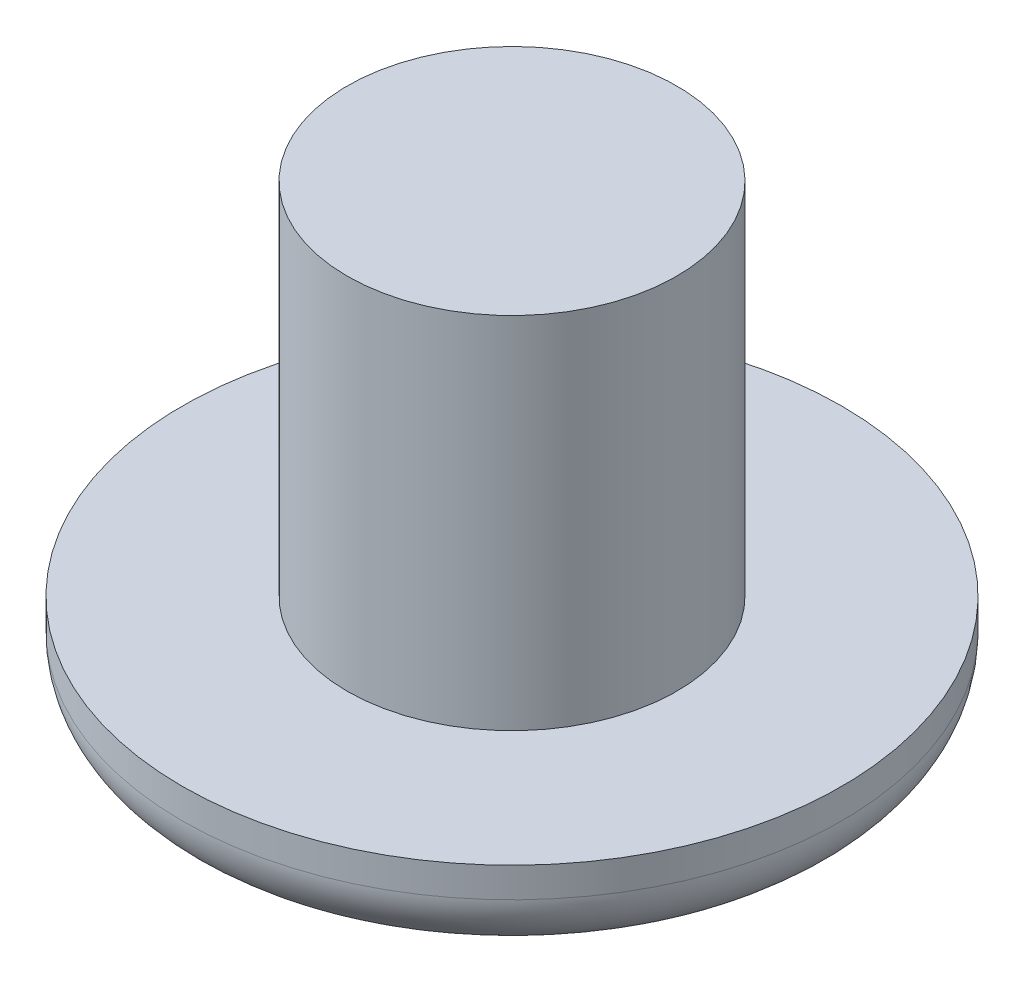
ISO-10303-21;
HEADER;
FILE_DESCRIPTION(('STEP AP214'),'2;1');
FILE_NAME('part.step','',(''),(''),'','','');
FILE_SCHEMA(('AUTOMOTIVE_DESIGN { 1 0 10303 214 1 1 1 1 }'));
ENDSEC;
DATA;
#1=APPLICATION_CONTEXT('core data for automotive mechanical design processes');
#2=APPLICATION_PROTOCOL_DEFINITION('international standard','automotive_design',2000,#1);
#3=PRODUCT_CONTEXT('',#1,'mechanical');
#4=PRODUCT('Part','Part','',(#3));
#5=PRODUCT_RELATED_PRODUCT_CATEGORY('part','',(#4));
#6=PRODUCT_DEFINITION_FORMATION('','',#4);
#7=PRODUCT_DEFINITION_CONTEXT('part definition',#1,'design');
#8=PRODUCT_DEFINITION('design','',#6,#7);
#9=PRODUCT_DEFINITION_SHAPE('','',#8);
#10=(LENGTH_UNIT() NAMED_UNIT(*) SI_UNIT(.MILLI.,.METRE.));
#11=(NAMED_UNIT(*) PLANE_ANGLE_UNIT() SI_UNIT($,.RADIAN.));
#12=(NAMED_UNIT(*) SI_UNIT($,.STERADIAN.) SOLID_ANGLE_UNIT());
#13=UNCERTAINTY_MEASURE_WITH_UNIT(LENGTH_MEASURE(1.E-05),#10,'distance_accuracy_value','');
#14=(GEOMETRIC_REPRESENTATION_CONTEXT(3) GLOBAL_UNCERTAINTY_ASSIGNED_CONTEXT((#13)) GLOBAL_UNIT_ASSIGNED_CONTEXT((#10,
#11,#12)) REPRESENTATION_CONTEXT('',''));
#15=CARTESIAN_POINT('',(0.,0.,0.));
#16=DIRECTION('',(0.,0.,1.));
#17=DIRECTION('',(1.,0.,0.));
#18=AXIS2_PLACEMENT_3D('',#15,#16,#17);
#19=CARTESIAN_POINT('',(0.,12.,0.));
#20=DIRECTION('',(0.,-1.,0.));
#21=DIRECTION('',(0.,0.,-1.));
#22=AXIS2_PLACEMENT_3D('',#19,#20,#21);
#23=CYLINDRICAL_SURFACE('',#22,5.5);
#24=CARTESIAN_POINT('',(0.,12.,0.));
#25=DIRECTION('',(0.,1.,0.));
#26=DIRECTION('',(0.,0.,1.));
#27=AXIS2_PLACEMENT_3D('',#24,#25,#26);
#28=CIRCLE('',#27,5.5);
#29=CARTESIAN_POINT('',(0.,12.,5.5));
#30=VERTEX_POINT('',#29);
#31=EDGE_CURVE('E54',#30,#30,#28,.T.);
#32=ORIENTED_EDGE('',*,*,#31,.F.);
#33=EDGE_LOOP('',(#32));
#34=FACE_BOUND('',#33,.T.);
#35=CARTESIAN_POINT('',(0.,0.,0.));
#36=DIRECTION('',(0.,1.,0.));
#37=DIRECTION('',(0.,0.,1.));
#38=AXIS2_PLACEMENT_3D('',#35,#36,#37);
#39=CIRCLE('',#38,5.5);
#40=CARTESIAN_POINT('',(0.,0.,5.5));
#41=VERTEX_POINT('',#40);
#42=EDGE_CURVE('E58',#41,#41,#39,.T.);
#43=ORIENTED_EDGE('',*,*,#42,.T.);
#44=EDGE_LOOP('',(#43));
#45=FACE_BOUND('',#44,.T.);
#46=ADVANCED_FACE('F43',(#34,#45),#23,.T.);
#47=CARTESIAN_POINT('',(0.,12.,0.));
#48=DIRECTION('',(0.,1.,0.));
#49=DIRECTION('',(0.,0.,1.));
#50=AXIS2_PLACEMENT_3D('',#47,#48,#49);
#51=PLANE('',#50);
#52=ORIENTED_EDGE('',*,*,#31,.T.);
#53=EDGE_LOOP('',(#52));
#54=FACE_BOUND('',#53,.T.);
#55=ADVANCED_FACE('F72',(#54),#51,.T.);
#56=CARTESIAN_POINT('',(0.,-3.,0.));
#57=DIRECTION('',(0.,1.,0.));
#58=DIRECTION('',(0.,0.,1.));
#59=AXIS2_PLACEMENT_3D('',#56,#57,#58);
#60=CYLINDRICAL_SURFACE('',#59,11.);
#61=CARTESIAN_POINT('',(0.,-1.,0.));
#62=DIRECTION('',(0.,1.,0.));
#63=DIRECTION('',(0.,0.,1.));
#64=AXIS2_PLACEMENT_3D('',#61,#62,#63);
#65=CIRCLE('',#64,11.);
#66=CARTESIAN_POINT('',(0.,-1.,11.));
#67=VERTEX_POINT('',#66);
#68=EDGE_CURVE('E50',#67,#67,#65,.T.);
#69=ORIENTED_EDGE('',*,*,#68,.T.);
#70=EDGE_LOOP('',(#69));
#71=FACE_BOUND('',#70,.T.);
#72=CARTESIAN_POINT('',(0.,0.,0.));
#73=DIRECTION('',(0.,1.,0.));
#74=DIRECTION('',(0.,0.,1.));
#75=AXIS2_PLACEMENT_3D('',#72,#73,#74);
#76=CIRCLE('',#75,11.);
#77=CARTESIAN_POINT('',(0.,0.,11.));
#78=VERTEX_POINT('',#77);
#79=EDGE_CURVE('E62',#78,#78,#76,.T.);
#80=ORIENTED_EDGE('',*,*,#79,.F.);
#81=EDGE_LOOP('',(#80));
#82=FACE_BOUND('',#81,.T.);
#83=ADVANCED_FACE('F69',(#71,#82),#60,.T.);
#84=CARTESIAN_POINT('',(0.,-3.,0.));
#85=DIRECTION('',(0.,1.,0.));
#86=DIRECTION('',(0.,0.,1.));
#87=AXIS2_PLACEMENT_3D('',#84,#85,#86);
#88=PLANE('',#87);
#89=CARTESIAN_POINT('',(0.,-3.,0.));
#90=DIRECTION('',(0.,1.,0.));
#91=DIRECTION('',(0.,0.,1.));
#92=AXIS2_PLACEMENT_3D('',#89,#90,#91);
#93=CIRCLE('',#92,9.);
#94=CARTESIAN_POINT('',(0.,-3.,9.));
#95=VERTEX_POINT('',#94);
#96=EDGE_CURVE('E11',#95,#95,#93,.F.);
#97=ORIENTED_EDGE('',*,*,#96,.T.);
#98=EDGE_LOOP('',(#97));
#99=FACE_BOUND('',#98,.T.);
#100=ADVANCED_FACE('F71',(#99),#88,.F.);
#101=CARTESIAN_POINT('',(0.,0.,0.));
#102=DIRECTION('',(0.,1.,0.));
#103=DIRECTION('',(0.,0.,1.));
#104=AXIS2_PLACEMENT_3D('',#101,#102,#103);
#105=PLANE('',#104);
#106=ORIENTED_EDGE('',*,*,#42,.F.);
#107=EDGE_LOOP('',(#106));
#108=FACE_BOUND('',#107,.T.);
#109=ORIENTED_EDGE('',*,*,#79,.T.);
#110=EDGE_LOOP('',(#109));
#111=FACE_BOUND('',#110,.T.);
#112=ADVANCED_FACE('F67',(#108,#111),#105,.T.);
#113=CARTESIAN_POINT('',(0.,-1.,0.));
#114=DIRECTION('',(0.,1.,0.));
#115=DIRECTION('',(0.,0.,1.));
#116=AXIS2_PLACEMENT_3D('',#113,#114,#115);
#117=TOROIDAL_SURFACE('',#116,9.,2.);
#118=ORIENTED_EDGE('',*,*,#96,.F.);
#119=EDGE_LOOP('',(#118));
#120=FACE_BOUND('',#119,.T.);
#121=ORIENTED_EDGE('',*,*,#68,.F.);
#122=EDGE_LOOP('',(#121));
#123=FACE_BOUND('',#122,.T.);
#124=ADVANCED_FACE('F45',(#120,#123),#117,.T.);
#125=CLOSED_SHELL('',(#46,#55,#83,#100,#112,#124));
#126=MANIFOLD_SOLID_BREP('B2',#125);
#127=ADVANCED_BREP_SHAPE_REPRESENTATION('',(#18,#126),#14);
#128=SHAPE_DEFINITION_REPRESENTATION(#9,#127);
ENDSEC;
END-ISO-10303-21;
